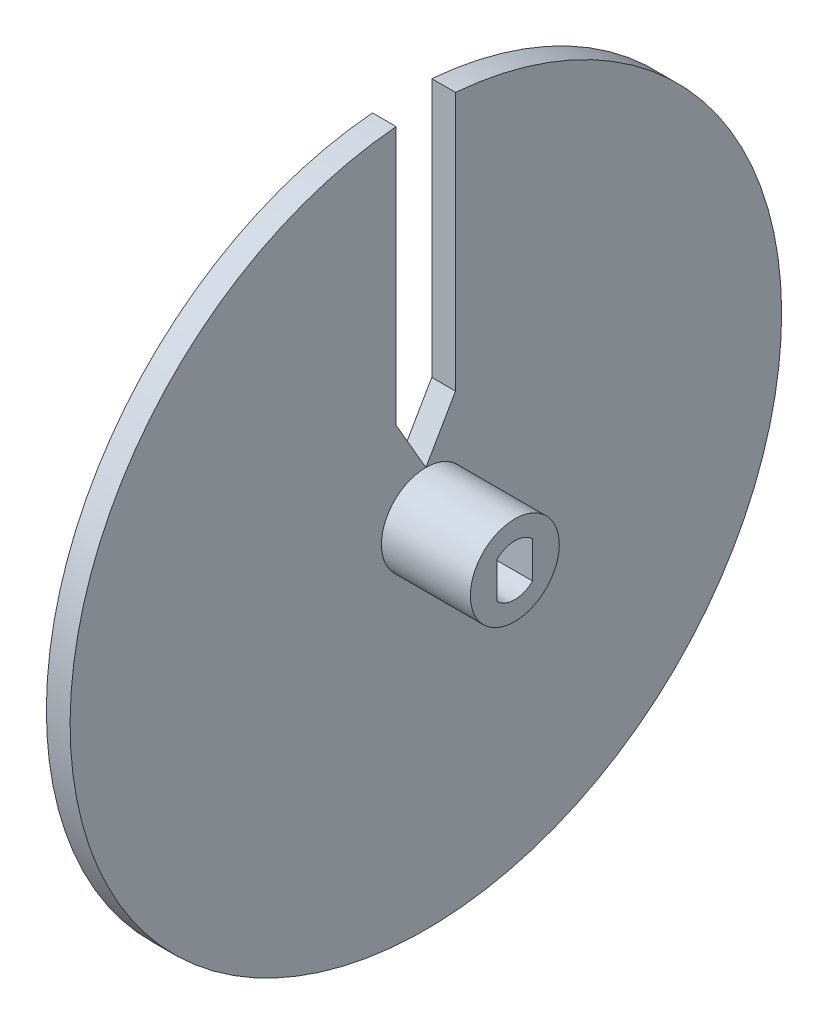
ISO-10303-21;
HEADER;
FILE_DESCRIPTION(('STEP AP214'),'2;1');
FILE_NAME('part.step','',(''),(''),'','','');
FILE_SCHEMA(('AUTOMOTIVE_DESIGN { 1 0 10303 214 1 1 1 1 }'));
ENDSEC;
DATA;
#1=APPLICATION_CONTEXT('core data for automotive mechanical design processes');
#2=APPLICATION_PROTOCOL_DEFINITION('international standard','automotive_design',2000,#1);
#3=PRODUCT_CONTEXT('',#1,'mechanical');
#4=PRODUCT('Part','Part','',(#3));
#5=PRODUCT_RELATED_PRODUCT_CATEGORY('part','',(#4));
#6=PRODUCT_DEFINITION_FORMATION('','',#4);
#7=PRODUCT_DEFINITION_CONTEXT('part definition',#1,'design');
#8=PRODUCT_DEFINITION('design','',#6,#7);
#9=PRODUCT_DEFINITION_SHAPE('','',#8);
#10=(LENGTH_UNIT() NAMED_UNIT(*) SI_UNIT(.MILLI.,.METRE.));
#11=(NAMED_UNIT(*) PLANE_ANGLE_UNIT() SI_UNIT($,.RADIAN.));
#12=(NAMED_UNIT(*) SI_UNIT($,.STERADIAN.) SOLID_ANGLE_UNIT());
#13=UNCERTAINTY_MEASURE_WITH_UNIT(LENGTH_MEASURE(1.E-05),#10,'distance_accuracy_value','');
#14=(GEOMETRIC_REPRESENTATION_CONTEXT(3) GLOBAL_UNCERTAINTY_ASSIGNED_CONTEXT((#13)) GLOBAL_UNIT_ASSIGNED_CONTEXT((#10,
#11,#12)) REPRESENTATION_CONTEXT('',''));
#15=CARTESIAN_POINT('',(0.,0.,0.));
#16=DIRECTION('',(0.,0.,1.));
#17=DIRECTION('',(1.,0.,0.));
#18=AXIS2_PLACEMENT_3D('',#15,#16,#17);
#19=CARTESIAN_POINT('',(-2.54,0.,0.));
#20=DIRECTION('',(1.,0.,0.));
#21=DIRECTION('',(0.,0.,-1.));
#22=AXIS2_PLACEMENT_3D('',#19,#20,#21);
#23=CYLINDRICAL_SURFACE('',#22,38.1);
#24=DIRECTION('',(1.,0.,0.));
#25=VECTOR('',#24,1.);
#26=CARTESIAN_POINT('',(-2.54,37.9674778593469,-3.175));
#27=LINE('',#26,#25);
#28=CARTESIAN_POINT('',(0.,37.9674778593469,-3.175));
#29=VERTEX_POINT('',#28);
#30=CARTESIAN_POINT('',(-2.54,37.9674778593469,-3.175));
#31=VERTEX_POINT('',#30);
#32=EDGE_CURVE('E122',#29,#31,#27,.F.);
#33=ORIENTED_EDGE('',*,*,#32,.F.);
#34=CARTESIAN_POINT('',(0.,0.,0.));
#35=DIRECTION('',(-1.,0.,0.));
#36=DIRECTION('',(0.,0.,1.));
#37=AXIS2_PLACEMENT_3D('',#34,#35,#36);
#38=CIRCLE('',#37,38.1);
#39=CARTESIAN_POINT('',(0.,37.9674778593469,3.175));
#40=VERTEX_POINT('',#39);
#41=EDGE_CURVE('E152',#29,#40,#38,.T.);
#42=ORIENTED_EDGE('',*,*,#41,.T.);
#43=DIRECTION('',(1.,0.,0.));
#44=VECTOR('',#43,1.);
#45=CARTESIAN_POINT('',(-2.54,37.9674778593469,3.175));
#46=LINE('',#45,#44);
#47=CARTESIAN_POINT('',(-2.54,37.9674778593469,3.175));
#48=VERTEX_POINT('',#47);
#49=EDGE_CURVE('E61',#40,#48,#46,.F.);
#50=ORIENTED_EDGE('',*,*,#49,.T.);
#51=CARTESIAN_POINT('',(-2.54,0.,0.));
#52=DIRECTION('',(-1.,0.,0.));
#53=DIRECTION('',(0.,0.,1.));
#54=AXIS2_PLACEMENT_3D('',#51,#52,#53);
#55=CIRCLE('',#54,38.1);
#56=EDGE_CURVE('E153',#31,#48,#55,.T.);
#57=ORIENTED_EDGE('',*,*,#56,.F.);
#58=EDGE_LOOP('',(#33,#42,#50,#57));
#59=FACE_BOUND('',#58,.T.);
#60=ADVANCED_FACE('F46',(#59),#23,.T.);
#61=CARTESIAN_POINT('',(-2.54,0.,0.));
#62=DIRECTION('',(-1.,0.,0.));
#63=DIRECTION('',(0.,0.,1.));
#64=AXIS2_PLACEMENT_3D('',#61,#62,#63);
#65=PLANE('',#64);
#66=DIRECTION('',(0.,0.866025403784443,-0.499999999999992));
#67=VECTOR('',#66,1.);
#68=CARTESIAN_POINT('',(-2.54,4.7625,0.));
#69=LINE('',#68,#67);
#70=CARTESIAN_POINT('',(-2.54,4.7625,0.));
#71=VERTEX_POINT('',#70);
#72=CARTESIAN_POINT('',(-2.54,10.2617613140313,-3.175));
#73=VERTEX_POINT('',#72);
#74=EDGE_CURVE('E127',#71,#73,#69,.T.);
#75=ORIENTED_EDGE('',*,*,#74,.T.);
#76=DIRECTION('',(0.,-1.,0.));
#77=VECTOR('',#76,1.);
#78=CARTESIAN_POINT('',(-2.54,38.1,-3.175));
#79=LINE('',#78,#77);
#80=EDGE_CURVE('E116',#31,#73,#79,.T.);
#81=ORIENTED_EDGE('',*,*,#80,.F.);
#82=ORIENTED_EDGE('',*,*,#56,.T.);
#83=DIRECTION('',(0.,-1.,0.));
#84=VECTOR('',#83,1.);
#85=CARTESIAN_POINT('',(-2.54,38.1,3.175));
#86=LINE('',#85,#84);
#87=CARTESIAN_POINT('',(-2.54,10.2617613140313,3.175));
#88=VERTEX_POINT('',#87);
#89=EDGE_CURVE('E142',#48,#88,#86,.T.);
#90=ORIENTED_EDGE('',*,*,#89,.T.);
#91=DIRECTION('',(0.,-0.866025403784443,-0.499999999999992));
#92=VECTOR('',#91,1.);
#93=CARTESIAN_POINT('',(-2.54,10.2617613140313,3.175));
#94=LINE('',#93,#92);
#95=EDGE_CURVE('E140',#88,#71,#94,.T.);
#96=ORIENTED_EDGE('',*,*,#95,.T.);
#97=EDGE_LOOP('',(#75,#81,#82,#90,#96));
#98=FACE_BOUND('',#97,.T.);
#99=ADVANCED_FACE('F137',(#98),#65,.T.);
#100=CARTESIAN_POINT('',(0.,0.,0.));
#101=DIRECTION('',(-1.,0.,0.));
#102=DIRECTION('',(0.,0.,1.));
#103=AXIS2_PLACEMENT_3D('',#100,#101,#102);
#104=PLANE('',#103);
#105=DIRECTION('',(0.,1.,0.));
#106=VECTOR('',#105,1.);
#107=CARTESIAN_POINT('',(0.,0.,-3.175));
#108=LINE('',#107,#106);
#109=CARTESIAN_POINT('',(0.,10.2617613140313,-3.175));
#110=VERTEX_POINT('',#109);
#111=EDGE_CURVE('E11',#110,#29,#108,.T.);
#112=ORIENTED_EDGE('',*,*,#111,.F.);
#113=DIRECTION('',(0.,-0.866025403784443,0.499999999999992));
#114=VECTOR('',#113,1.);
#115=CARTESIAN_POINT('',(0.,1.19062499999996,2.06222299276167));
#116=LINE('',#115,#114);
#117=CARTESIAN_POINT('',(0.,4.7625,0.));
#118=VERTEX_POINT('',#117);
#119=EDGE_CURVE('E54',#110,#118,#116,.T.);
#120=ORIENTED_EDGE('',*,*,#119,.T.);
#121=CARTESIAN_POINT('',(0.,0.,0.));
#122=DIRECTION('',(1.,0.,0.));
#123=DIRECTION('',(0.,0.,-1.));
#124=AXIS2_PLACEMENT_3D('',#121,#122,#123);
#125=CIRCLE('',#124,4.7625);
#126=EDGE_CURVE('E155',#118,#118,#125,.T.);
#127=ORIENTED_EDGE('',*,*,#126,.F.);
#128=DIRECTION('',(0.,0.866025403784443,0.499999999999992));
#129=VECTOR('',#128,1.);
#130=CARTESIAN_POINT('',(0.,1.19062499999996,-2.06222299276167));
#131=LINE('',#130,#129);
#132=CARTESIAN_POINT('',(0.,10.2617613140313,3.175));
#133=VERTEX_POINT('',#132);
#134=EDGE_CURVE('E193',#118,#133,#131,.T.);
#135=ORIENTED_EDGE('',*,*,#134,.T.);
#136=DIRECTION('',(0.,1.,0.));
#137=VECTOR('',#136,1.);
#138=CARTESIAN_POINT('',(0.,0.,3.175));
#139=LINE('',#138,#137);
#140=EDGE_CURVE('E189',#133,#40,#139,.T.);
#141=ORIENTED_EDGE('',*,*,#140,.T.);
#142=ORIENTED_EDGE('',*,*,#41,.F.);
#143=EDGE_LOOP('',(#112,#120,#127,#135,#141,#142));
#144=FACE_BOUND('',#143,.T.);
#145=ADVANCED_FACE('F197',(#144),#104,.F.);
#146=CARTESIAN_POINT('',(9.525,0.,0.));
#147=DIRECTION('',(1.,0.,0.));
#148=DIRECTION('',(0.,0.,-1.));
#149=AXIS2_PLACEMENT_3D('',#146,#147,#148);
#150=PLANE('',#149);
#151=CARTESIAN_POINT('',(9.525,0.,0.));
#152=DIRECTION('',(1.,0.,0.));
#153=DIRECTION('',(0.,0.,-1.));
#154=AXIS2_PLACEMENT_3D('',#151,#152,#153);
#155=CIRCLE('',#154,4.7625);
#156=CARTESIAN_POINT('',(9.525,0.,-4.7625));
#157=VERTEX_POINT('',#156);
#158=EDGE_CURVE('E186',#157,#157,#155,.T.);
#159=ORIENTED_EDGE('',*,*,#158,.T.);
#160=EDGE_LOOP('',(#159));
#161=FACE_BOUND('',#160,.T.);
#162=DIRECTION('',(0.,1.,0.));
#163=VECTOR('',#162,1.);
#164=CARTESIAN_POINT('',(9.525,-1.95617106869517,-1.905));
#165=LINE('',#164,#163);
#166=CARTESIAN_POINT('',(9.525,-1.95617106869517,-1.905));
#167=VERTEX_POINT('',#166);
#168=CARTESIAN_POINT('',(9.525,1.95617106869517,-1.905));
#169=VERTEX_POINT('',#168);
#170=EDGE_CURVE('E160',#167,#169,#165,.T.);
#171=ORIENTED_EDGE('',*,*,#170,.F.);
#172=CARTESIAN_POINT('',(9.525,0.,0.));
#173=DIRECTION('',(1.,0.,0.));
#174=DIRECTION('',(0.,0.,-1.));
#175=AXIS2_PLACEMENT_3D('',#172,#173,#174);
#176=CIRCLE('',#175,2.7305);
#177=CARTESIAN_POINT('',(9.525,-1.95617106869517,1.905));
#178=VERTEX_POINT('',#177);
#179=EDGE_CURVE('E158',#178,#167,#176,.T.);
#180=ORIENTED_EDGE('',*,*,#179,.F.);
#181=DIRECTION('',(0.,-1.,0.));
#182=VECTOR('',#181,1.);
#183=CARTESIAN_POINT('',(9.525,-1.95617106869517,1.905));
#184=LINE('',#183,#182);
#185=CARTESIAN_POINT('',(9.525,1.95617106869517,1.905));
#186=VERTEX_POINT('',#185);
#187=EDGE_CURVE('E165',#186,#178,#184,.T.);
#188=ORIENTED_EDGE('',*,*,#187,.F.);
#189=CARTESIAN_POINT('',(9.525,0.,0.));
#190=DIRECTION('',(1.,0.,0.));
#191=DIRECTION('',(0.,0.,-1.));
#192=AXIS2_PLACEMENT_3D('',#189,#190,#191);
#193=CIRCLE('',#192,2.7305);
#194=EDGE_CURVE('E163',#169,#186,#193,.T.);
#195=ORIENTED_EDGE('',*,*,#194,.F.);
#196=EDGE_LOOP('',(#171,#180,#188,#195));
#197=FACE_BOUND('',#196,.T.);
#198=ADVANCED_FACE('F203',(#161,#197),#150,.T.);
#199=CARTESIAN_POINT('',(9.525,0.,0.));
#200=DIRECTION('',(-1.,0.,0.));
#201=DIRECTION('',(0.,0.,1.));
#202=AXIS2_PLACEMENT_3D('',#199,#200,#201);
#203=CYLINDRICAL_SURFACE('',#202,4.7625);
#204=ORIENTED_EDGE('',*,*,#126,.T.);
#205=EDGE_LOOP('',(#204));
#206=FACE_BOUND('',#205,.T.);
#207=ORIENTED_EDGE('',*,*,#158,.F.);
#208=EDGE_LOOP('',(#207));
#209=FACE_BOUND('',#208,.T.);
#210=ADVANCED_FACE('F48',(#206,#209),#203,.T.);
#211=CARTESIAN_POINT('',(9.525,0.,0.));
#212=DIRECTION('',(-1.,0.,0.));
#213=DIRECTION('',(0.,0.,1.));
#214=AXIS2_PLACEMENT_3D('',#211,#212,#213);
#215=CYLINDRICAL_SURFACE('',#214,2.7305);
#216=CARTESIAN_POINT('',(0.,0.,0.));
#217=DIRECTION('',(1.,0.,0.));
#218=DIRECTION('',(0.,0.,-1.));
#219=AXIS2_PLACEMENT_3D('',#216,#217,#218);
#220=CIRCLE('',#219,2.7305);
#221=CARTESIAN_POINT('',(0.,-1.95617106869517,1.905));
#222=VERTEX_POINT('',#221);
#223=CARTESIAN_POINT('',(0.,-1.95617106869517,-1.905));
#224=VERTEX_POINT('',#223);
#225=EDGE_CURVE('E168',#222,#224,#220,.T.);
#226=ORIENTED_EDGE('',*,*,#225,.F.);
#227=DIRECTION('',(-1.,0.,0.));
#228=VECTOR('',#227,1.);
#229=CARTESIAN_POINT('',(9.525,-1.95617106869517,1.905));
#230=LINE('',#229,#228);
#231=EDGE_CURVE('E167',#178,#222,#230,.T.);
#232=ORIENTED_EDGE('',*,*,#231,.F.);
#233=ORIENTED_EDGE('',*,*,#179,.T.);
#234=DIRECTION('',(-1.,0.,0.));
#235=VECTOR('',#234,1.);
#236=CARTESIAN_POINT('',(9.525,-1.95617106869517,-1.905));
#237=LINE('',#236,#235);
#238=EDGE_CURVE('E183',#167,#224,#237,.T.);
#239=ORIENTED_EDGE('',*,*,#238,.T.);
#240=EDGE_LOOP('',(#226,#232,#233,#239));
#241=FACE_BOUND('',#240,.T.);
#242=ADVANCED_FACE('F202',(#241),#215,.F.);
#243=CARTESIAN_POINT('',(9.525,-1.95617106869517,-1.905));
#244=DIRECTION('',(0.,0.,1.));
#245=DIRECTION('',(1.,0.,0.));
#246=AXIS2_PLACEMENT_3D('',#243,#244,#245);
#247=PLANE('',#246);
#248=DIRECTION('',(0.,1.,0.));
#249=VECTOR('',#248,1.);
#250=CARTESIAN_POINT('',(0.,-1.95617106869517,-1.905));
#251=LINE('',#250,#249);
#252=CARTESIAN_POINT('',(0.,1.95617106869517,-1.905));
#253=VERTEX_POINT('',#252);
#254=EDGE_CURVE('E171',#224,#253,#251,.T.);
#255=ORIENTED_EDGE('',*,*,#254,.F.);
#256=ORIENTED_EDGE('',*,*,#238,.F.);
#257=ORIENTED_EDGE('',*,*,#170,.T.);
#258=DIRECTION('',(-1.,0.,0.));
#259=VECTOR('',#258,1.);
#260=CARTESIAN_POINT('',(9.525,1.95617106869517,-1.905));
#261=LINE('',#260,#259);
#262=EDGE_CURVE('E181',#169,#253,#261,.T.);
#263=ORIENTED_EDGE('',*,*,#262,.T.);
#264=EDGE_LOOP('',(#255,#256,#257,#263));
#265=FACE_BOUND('',#264,.T.);
#266=ADVANCED_FACE('F215',(#265),#247,.T.);
#267=CARTESIAN_POINT('',(9.525,0.,0.));
#268=DIRECTION('',(-1.,0.,0.));
#269=DIRECTION('',(0.,0.,1.));
#270=AXIS2_PLACEMENT_3D('',#267,#268,#269);
#271=CYLINDRICAL_SURFACE('',#270,2.7305);
#272=CARTESIAN_POINT('',(0.,0.,0.));
#273=DIRECTION('',(1.,0.,0.));
#274=DIRECTION('',(0.,0.,-1.));
#275=AXIS2_PLACEMENT_3D('',#272,#273,#274);
#276=CIRCLE('',#275,2.7305);
#277=CARTESIAN_POINT('',(0.,1.95617106869517,1.905));
#278=VERTEX_POINT('',#277);
#279=EDGE_CURVE('E174',#253,#278,#276,.T.);
#280=ORIENTED_EDGE('',*,*,#279,.F.);
#281=ORIENTED_EDGE('',*,*,#262,.F.);
#282=ORIENTED_EDGE('',*,*,#194,.T.);
#283=DIRECTION('',(-1.,0.,0.));
#284=VECTOR('',#283,1.);
#285=CARTESIAN_POINT('',(9.525,1.95617106869517,1.905));
#286=LINE('',#285,#284);
#287=EDGE_CURVE('E69',#186,#278,#286,.T.);
#288=ORIENTED_EDGE('',*,*,#287,.T.);
#289=EDGE_LOOP('',(#280,#281,#282,#288));
#290=FACE_BOUND('',#289,.T.);
#291=ADVANCED_FACE('F218',(#290),#271,.F.);
#292=CARTESIAN_POINT('',(9.525,-1.95617106869517,1.905));
#293=DIRECTION('',(0.,0.,-1.));
#294=DIRECTION('',(-1.,0.,0.));
#295=AXIS2_PLACEMENT_3D('',#292,#293,#294);
#296=PLANE('',#295);
#297=DIRECTION('',(0.,-1.,0.));
#298=VECTOR('',#297,1.);
#299=CARTESIAN_POINT('',(0.,-1.95617106869517,1.905));
#300=LINE('',#299,#298);
#301=EDGE_CURVE('E161',#278,#222,#300,.T.);
#302=ORIENTED_EDGE('',*,*,#301,.F.);
#303=ORIENTED_EDGE('',*,*,#287,.F.);
#304=ORIENTED_EDGE('',*,*,#187,.T.);
#305=ORIENTED_EDGE('',*,*,#231,.T.);
#306=EDGE_LOOP('',(#302,#303,#304,#305));
#307=FACE_BOUND('',#306,.T.);
#308=ADVANCED_FACE('F224',(#307),#296,.T.);
#309=ORIENTED_EDGE('',*,*,#301,.T.);
#310=ORIENTED_EDGE('',*,*,#225,.T.);
#311=ORIENTED_EDGE('',*,*,#254,.T.);
#312=ORIENTED_EDGE('',*,*,#279,.T.);
#313=EDGE_LOOP('',(#309,#310,#311,#312));
#314=FACE_BOUND('',#313,.T.);
#315=ADVANCED_FACE('F220',(#314),#104,.F.);
#316=CARTESIAN_POINT('',(-2.54,38.1,-3.175));
#317=DIRECTION('',(0.,0.,1.));
#318=DIRECTION('',(1.,0.,0.));
#319=AXIS2_PLACEMENT_3D('',#316,#317,#318);
#320=PLANE('',#319);
#321=ORIENTED_EDGE('',*,*,#32,.T.);
#322=ORIENTED_EDGE('',*,*,#80,.T.);
#323=DIRECTION('',(1.,0.,0.));
#324=VECTOR('',#323,1.);
#325=CARTESIAN_POINT('',(-2.54,10.2617613140313,-3.175));
#326=LINE('',#325,#324);
#327=EDGE_CURVE('E119',#73,#110,#326,.T.);
#328=ORIENTED_EDGE('',*,*,#327,.T.);
#329=ORIENTED_EDGE('',*,*,#111,.T.);
#330=EDGE_LOOP('',(#321,#322,#328,#329));
#331=FACE_BOUND('',#330,.T.);
#332=ADVANCED_FACE('F118',(#331),#320,.T.);
#333=CARTESIAN_POINT('',(-2.54,4.7625,0.));
#334=DIRECTION('',(0.,-0.499999999999992,-0.866025403784443));
#335=DIRECTION('',(0.,0.866025403784443,-0.499999999999992));
#336=AXIS2_PLACEMENT_3D('',#333,#334,#335);
#337=PLANE('',#336);
#338=ORIENTED_EDGE('',*,*,#327,.F.);
#339=ORIENTED_EDGE('',*,*,#74,.F.);
#340=DIRECTION('',(1.,0.,0.));
#341=VECTOR('',#340,1.);
#342=CARTESIAN_POINT('',(-2.54,4.7625,0.));
#343=LINE('',#342,#341);
#344=EDGE_CURVE('E135',#71,#118,#343,.T.);
#345=ORIENTED_EDGE('',*,*,#344,.T.);
#346=ORIENTED_EDGE('',*,*,#119,.F.);
#347=EDGE_LOOP('',(#338,#339,#345,#346));
#348=FACE_BOUND('',#347,.T.);
#349=ADVANCED_FACE('F131',(#348),#337,.F.);
#350=CARTESIAN_POINT('',(-2.54,10.2617613140313,3.175));
#351=DIRECTION('',(0.,-0.499999999999992,0.866025403784443));
#352=DIRECTION('',(0.,-0.866025403784443,-0.499999999999992));
#353=AXIS2_PLACEMENT_3D('',#350,#351,#352);
#354=PLANE('',#353);
#355=ORIENTED_EDGE('',*,*,#344,.F.);
#356=ORIENTED_EDGE('',*,*,#95,.F.);
#357=DIRECTION('',(1.,0.,0.));
#358=VECTOR('',#357,1.);
#359=CARTESIAN_POINT('',(-2.54,10.2617613140313,3.175));
#360=LINE('',#359,#358);
#361=EDGE_CURVE('E146',#88,#133,#360,.T.);
#362=ORIENTED_EDGE('',*,*,#361,.T.);
#363=ORIENTED_EDGE('',*,*,#134,.F.);
#364=EDGE_LOOP('',(#355,#356,#362,#363));
#365=FACE_BOUND('',#364,.T.);
#366=ADVANCED_FACE('F246',(#365),#354,.F.);
#367=CARTESIAN_POINT('',(-2.54,38.1,3.175));
#368=DIRECTION('',(0.,0.,1.));
#369=DIRECTION('',(1.,0.,0.));
#370=AXIS2_PLACEMENT_3D('',#367,#368,#369);
#371=PLANE('',#370);
#372=ORIENTED_EDGE('',*,*,#140,.F.);
#373=ORIENTED_EDGE('',*,*,#361,.F.);
#374=ORIENTED_EDGE('',*,*,#89,.F.);
#375=ORIENTED_EDGE('',*,*,#49,.F.);
#376=EDGE_LOOP('',(#372,#373,#374,#375));
#377=FACE_BOUND('',#376,.T.);
#378=ADVANCED_FACE('F249',(#377),#371,.F.);
#379=CLOSED_SHELL('',(#60,#99,#145,#198,#210,#242,#266,#291,#308,#315,#332,#349,#366,#378));
#380=MANIFOLD_SOLID_BREP('B2',#379);
#381=ADVANCED_BREP_SHAPE_REPRESENTATION('',(#18,#380),#14);
#382=SHAPE_DEFINITION_REPRESENTATION(#9,#381);
ENDSEC;
END-ISO-10303-21;
